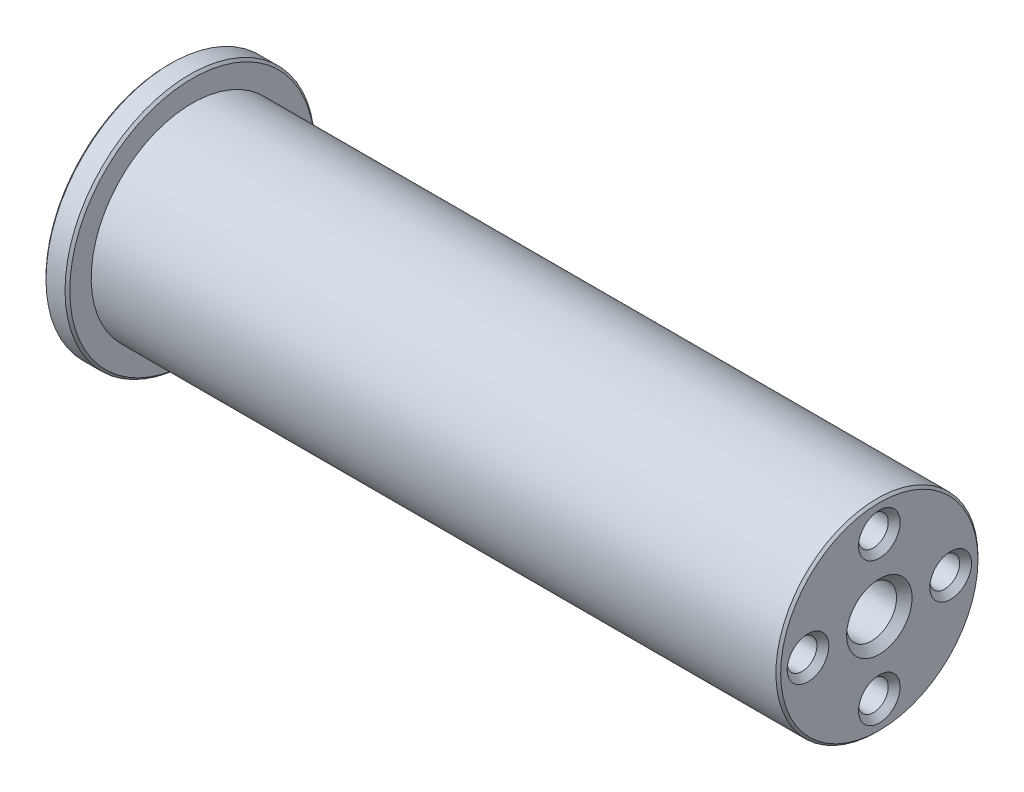
ISO-10303-21;
HEADER;
FILE_DESCRIPTION(('STEP AP214'),'2;1');
FILE_NAME('part.step','',(''),(''),'','','');
FILE_SCHEMA(('AUTOMOTIVE_DESIGN { 1 0 10303 214 1 1 1 1 }'));
ENDSEC;
DATA;
#1=APPLICATION_CONTEXT('core data for automotive mechanical design processes');
#2=APPLICATION_PROTOCOL_DEFINITION('international standard','automotive_design',2000,#1);
#3=PRODUCT_CONTEXT('',#1,'mechanical');
#4=PRODUCT('Part','Part','',(#3));
#5=PRODUCT_RELATED_PRODUCT_CATEGORY('part','',(#4));
#6=PRODUCT_DEFINITION_FORMATION('','',#4);
#7=PRODUCT_DEFINITION_CONTEXT('part definition',#1,'design');
#8=PRODUCT_DEFINITION('design','',#6,#7);
#9=PRODUCT_DEFINITION_SHAPE('','',#8);
#10=(LENGTH_UNIT() NAMED_UNIT(*) SI_UNIT(.MILLI.,.METRE.));
#11=(NAMED_UNIT(*) PLANE_ANGLE_UNIT() SI_UNIT($,.RADIAN.));
#12=(NAMED_UNIT(*) SI_UNIT($,.STERADIAN.) SOLID_ANGLE_UNIT());
#13=UNCERTAINTY_MEASURE_WITH_UNIT(LENGTH_MEASURE(1.E-05),#10,'distance_accuracy_value','');
#14=(GEOMETRIC_REPRESENTATION_CONTEXT(3) GLOBAL_UNCERTAINTY_ASSIGNED_CONTEXT((#13)) GLOBAL_UNIT_ASSIGNED_CONTEXT((#10,
#11,#12)) REPRESENTATION_CONTEXT('',''));
#15=CARTESIAN_POINT('',(0.,0.,0.));
#16=DIRECTION('',(0.,0.,1.));
#17=DIRECTION('',(1.,0.,0.));
#18=AXIS2_PLACEMENT_3D('',#15,#16,#17);
#19=CARTESIAN_POINT('',(64.8004303095138,-0.500000000036733,0.));
#20=DIRECTION('',(-1.,0.,0.));
#21=DIRECTION('',(0.,-1.,0.));
#22=AXIS2_PLACEMENT_3D('',#19,#20,#21);
#23=CYLINDRICAL_SURFACE('',#22,10.4999999999632);
#24=CARTESIAN_POINT('',(65.0004303095139,-0.500000000036733,0.));
#25=DIRECTION('',(-1.,0.,0.));
#26=DIRECTION('',(0.,0.,1.));
#27=AXIS2_PLACEMENT_3D('',#24,#25,#26);
#28=CIRCLE('',#27,10.4999999999632);
#29=CARTESIAN_POINT('',(65.0004303095139,-0.500000000036733,10.4999999999632));
#30=VERTEX_POINT('',#29);
#31=EDGE_CURVE('E58',#30,#30,#28,.F.);
#32=ORIENTED_EDGE('',*,*,#31,.T.);
#33=EDGE_LOOP('',(#32));
#34=FACE_BOUND('',#33,.T.);
#35=CARTESIAN_POINT('',(66.6004303095139,-0.500000000036733,0.));
#36=DIRECTION('',(1.,0.,0.));
#37=DIRECTION('',(0.,0.,-1.));
#38=AXIS2_PLACEMENT_3D('',#35,#36,#37);
#39=CIRCLE('',#38,10.4999999999632);
#40=CARTESIAN_POINT('',(66.6004303095139,-0.500000000036733,10.4999999999632));
#41=VERTEX_POINT('',#40);
#42=EDGE_CURVE('E154',#41,#41,#39,.F.);
#43=ORIENTED_EDGE('',*,*,#42,.T.);
#44=EDGE_LOOP('',(#43));
#45=FACE_BOUND('',#44,.T.);
#46=ADVANCED_FACE('F48',(#34,#45),#23,.T.);
#47=CARTESIAN_POINT('',(66.8004303095138,-11.,0.));
#48=DIRECTION('',(1.,0.,0.));
#49=DIRECTION('',(0.,1.,0.));
#50=AXIS2_PLACEMENT_3D('',#47,#48,#49);
#51=PLANE('',#50);
#52=CARTESIAN_POINT('',(66.8004303095138,-0.500000000036733,0.));
#53=DIRECTION('',(1.,0.,0.));
#54=DIRECTION('',(0.,1.,0.));
#55=AXIS2_PLACEMENT_3D('',#52,#53,#54);
#56=CIRCLE('',#55,10.2999999999633);
#57=CARTESIAN_POINT('',(66.8004303095138,-0.500000000036733,10.2999999999633));
#58=VERTEX_POINT('',#57);
#59=EDGE_CURVE('E11',#58,#58,#56,.T.);
#60=ORIENTED_EDGE('',*,*,#59,.T.);
#61=EDGE_LOOP('',(#60));
#62=FACE_BOUND('',#61,.T.);
#63=CARTESIAN_POINT('',(66.8004303095138,-0.500000000036733,0.));
#64=DIRECTION('',(-1.,0.,0.));
#65=DIRECTION('',(0.,-1.,0.));
#66=AXIS2_PLACEMENT_3D('',#63,#64,#65);
#67=CIRCLE('',#66,8.49999999996328);
#68=CARTESIAN_POINT('',(66.8004303095138,-9.00000000000001,0.));
#69=VERTEX_POINT('',#68);
#70=EDGE_CURVE('E127',#69,#69,#67,.T.);
#71=ORIENTED_EDGE('',*,*,#70,.T.);
#72=EDGE_LOOP('',(#71));
#73=FACE_BOUND('',#72,.T.);
#74=ADVANCED_FACE('F234',(#62,#73),#51,.T.);
#75=CARTESIAN_POINT('',(64.8004303095138,-0.500000000036733,0.));
#76=DIRECTION('',(-1.,0.,0.));
#77=DIRECTION('',(0.,-1.,0.));
#78=AXIS2_PLACEMENT_3D('',#75,#76,#77);
#79=CYLINDRICAL_SURFACE('',#78,8.49999999996328);
#80=CARTESIAN_POINT('',(124.400860619028,-0.500000000036723,0.));
#81=DIRECTION('',(1.,0.,0.));
#82=DIRECTION('',(0.,0.,-1.));
#83=AXIS2_PLACEMENT_3D('',#80,#81,#82);
#84=CIRCLE('',#83,8.49999999996328);
#85=CARTESIAN_POINT('',(124.400860619028,-0.500000000036723,-8.49999999996328));
#86=VERTEX_POINT('',#85);
#87=EDGE_CURVE('E131',#86,#86,#84,.F.);
#88=ORIENTED_EDGE('',*,*,#87,.T.);
#89=EDGE_LOOP('',(#88));
#90=FACE_BOUND('',#89,.T.);
#91=ORIENTED_EDGE('',*,*,#70,.F.);
#92=EDGE_LOOP('',(#91));
#93=FACE_BOUND('',#92,.T.);
#94=ADVANCED_FACE('F209',(#90,#93),#79,.T.);
#95=CARTESIAN_POINT('',(124.600860619028,-0.500000000036723,0.));
#96=DIRECTION('',(1.,0.,0.));
#97=DIRECTION('',(0.,1.,0.));
#98=AXIS2_PLACEMENT_3D('',#95,#96,#97);
#99=PLANE('',#98);
#100=CARTESIAN_POINT('',(124.600860619028,-0.500000000036723,0.));
#101=DIRECTION('',(1.,0.,0.));
#102=DIRECTION('',(0.,1.,0.));
#103=AXIS2_PLACEMENT_3D('',#100,#101,#102);
#104=CIRCLE('',#103,8.29999999996326);
#105=CARTESIAN_POINT('',(124.600860619028,7.79999999992654,0.));
#106=VERTEX_POINT('',#105);
#107=EDGE_CURVE('E146',#106,#106,#104,.T.);
#108=ORIENTED_EDGE('',*,*,#107,.T.);
#109=EDGE_LOOP('',(#108));
#110=FACE_BOUND('',#109,.T.);
#111=CARTESIAN_POINT('',(124.600860619028,-0.499999999999987,0.));
#112=DIRECTION('',(1.,0.,0.));
#113=DIRECTION('',(0.,0.,-1.));
#114=AXIS2_PLACEMENT_3D('',#111,#112,#113);
#115=CIRCLE('',#114,2.75);
#116=CARTESIAN_POINT('',(124.600860619028,-0.499999999999987,-2.75));
#117=VERTEX_POINT('',#116);
#118=EDGE_CURVE('E141',#117,#117,#115,.T.);
#119=ORIENTED_EDGE('',*,*,#118,.F.);
#120=EDGE_LOOP('',(#119));
#121=FACE_BOUND('',#120,.T.);
#122=CARTESIAN_POINT('',(124.600860619028,-0.500000000036785,-5.99999999996326));
#123=DIRECTION('',(1.,0.,0.));
#124=DIRECTION('',(0.,0.,-1.));
#125=AXIS2_PLACEMENT_3D('',#122,#123,#124);
#126=CIRCLE('',#125,1.75);
#127=CARTESIAN_POINT('',(124.600860619028,-0.500000000036785,-7.74999999996326));
#128=VERTEX_POINT('',#127);
#129=EDGE_CURVE('E92',#128,#128,#126,.T.);
#130=ORIENTED_EDGE('',*,*,#129,.F.);
#131=EDGE_LOOP('',(#130));
#132=FACE_BOUND('',#131,.T.);
#133=CARTESIAN_POINT('',(124.600860619028,5.49999999992654,0.));
#134=DIRECTION('',(1.,0.,0.));
#135=DIRECTION('',(0.,0.,-1.));
#136=AXIS2_PLACEMENT_3D('',#133,#134,#135);
#137=CIRCLE('',#136,1.75);
#138=CARTESIAN_POINT('',(124.600860619028,5.49999999992654,-1.75));
#139=VERTEX_POINT('',#138);
#140=EDGE_CURVE('E82',#139,#139,#137,.T.);
#141=ORIENTED_EDGE('',*,*,#140,.F.);
#142=EDGE_LOOP('',(#141));
#143=FACE_BOUND('',#142,.T.);
#144=CARTESIAN_POINT('',(124.600860619028,-0.500000000036702,5.99999999996326));
#145=DIRECTION('',(1.,0.,0.));
#146=DIRECTION('',(0.,0.,-1.));
#147=AXIS2_PLACEMENT_3D('',#144,#145,#146);
#148=CIRCLE('',#147,1.75);
#149=CARTESIAN_POINT('',(124.600860619028,-0.500000000036702,4.24999999996326));
#150=VERTEX_POINT('',#149);
#151=EDGE_CURVE('E103',#150,#150,#148,.T.);
#152=ORIENTED_EDGE('',*,*,#151,.F.);
#153=EDGE_LOOP('',(#152));
#154=FACE_BOUND('',#153,.T.);
#155=CARTESIAN_POINT('',(124.600860619028,-6.49999999999998,0.));
#156=DIRECTION('',(1.,0.,0.));
#157=DIRECTION('',(0.,0.,-1.));
#158=AXIS2_PLACEMENT_3D('',#155,#156,#157);
#159=CIRCLE('',#158,1.75);
#160=CARTESIAN_POINT('',(124.600860619028,-6.49999999999998,-1.75));
#161=VERTEX_POINT('',#160);
#162=EDGE_CURVE('E115',#161,#161,#159,.T.);
#163=ORIENTED_EDGE('',*,*,#162,.F.);
#164=EDGE_LOOP('',(#163));
#165=FACE_BOUND('',#164,.T.);
#166=ADVANCED_FACE('F174',(#110,#121,#132,#143,#154,#165),#99,.T.);
#167=CARTESIAN_POINT('',(64.8004303095138,-11.,0.));
#168=DIRECTION('',(-1.,0.,0.));
#169=DIRECTION('',(0.,-1.,0.));
#170=AXIS2_PLACEMENT_3D('',#167,#168,#169);
#171=PLANE('',#170);
#172=CARTESIAN_POINT('',(64.8004303095138,-0.500000000036733,0.));
#173=DIRECTION('',(-1.,0.,0.));
#174=DIRECTION('',(0.,-1.,0.));
#175=AXIS2_PLACEMENT_3D('',#172,#173,#174);
#176=CIRCLE('',#175,10.2999999999632);
#177=CARTESIAN_POINT('',(64.8004303095138,-10.7999999999999,0.));
#178=VERTEX_POINT('',#177);
#179=EDGE_CURVE('E150',#178,#178,#176,.T.);
#180=ORIENTED_EDGE('',*,*,#179,.T.);
#181=EDGE_LOOP('',(#180));
#182=FACE_BOUND('',#181,.T.);
#183=CARTESIAN_POINT('',(64.8004303095138,-0.499999999999996,0.));
#184=DIRECTION('',(-1.,0.,0.));
#185=DIRECTION('',(0.,0.,1.));
#186=AXIS2_PLACEMENT_3D('',#183,#184,#185);
#187=CIRCLE('',#186,2.75);
#188=CARTESIAN_POINT('',(64.8004303095138,-0.499999999999996,2.75));
#189=VERTEX_POINT('',#188);
#190=EDGE_CURVE('E178',#189,#189,#187,.T.);
#191=ORIENTED_EDGE('',*,*,#190,.F.);
#192=EDGE_LOOP('',(#191));
#193=FACE_BOUND('',#192,.T.);
#194=ADVANCED_FACE('F170',(#182,#193),#171,.T.);
#195=CARTESIAN_POINT('',(117.100860619028,-6.49999999999998,0.));
#196=DIRECTION('',(1.,0.,0.));
#197=DIRECTION('',(0.,0.,-1.));
#198=AXIS2_PLACEMENT_3D('',#195,#196,#197);
#199=CONICAL_SURFACE('',#198,1.25,1.02974425867666);
#200=CARTESIAN_POINT('',(116.349784845243,-6.49999999999998,0.));
#201=VERTEX_POINT('',#200);
#202=VERTEX_LOOP('',#201);
#203=FACE_BOUND('',#202,.T.);
#204=CARTESIAN_POINT('',(117.100860619028,-6.49999999999998,0.));
#205=DIRECTION('',(1.,0.,0.));
#206=DIRECTION('',(0.,0.,-1.));
#207=AXIS2_PLACEMENT_3D('',#204,#205,#206);
#208=CIRCLE('',#207,1.25);
#209=CARTESIAN_POINT('',(117.100860619028,-6.49999999999998,-1.25));
#210=VERTEX_POINT('',#209);
#211=EDGE_CURVE('E123',#210,#210,#208,.T.);
#212=ORIENTED_EDGE('',*,*,#211,.T.);
#213=EDGE_LOOP('',(#212));
#214=FACE_BOUND('',#213,.T.);
#215=ADVANCED_FACE('F173',(#203,#214),#199,.F.);
#216=CARTESIAN_POINT('',(124.600860619028,-6.49999999999998,0.));
#217=DIRECTION('',(1.,0.,0.));
#218=DIRECTION('',(0.,0.,-1.));
#219=AXIS2_PLACEMENT_3D('',#216,#217,#218);
#220=CYLINDRICAL_SURFACE('',#219,1.25);
#221=ORIENTED_EDGE('',*,*,#211,.F.);
#222=EDGE_LOOP('',(#221));
#223=FACE_BOUND('',#222,.T.);
#224=CARTESIAN_POINT('',(124.100860619028,-6.49999999999998,0.));
#225=DIRECTION('',(1.,0.,0.));
#226=DIRECTION('',(0.,0.,-1.));
#227=AXIS2_PLACEMENT_3D('',#224,#225,#226);
#228=CIRCLE('',#227,1.25);
#229=CARTESIAN_POINT('',(124.100860619028,-6.49999999999998,-1.25));
#230=VERTEX_POINT('',#229);
#231=EDGE_CURVE('E119',#230,#230,#228,.T.);
#232=ORIENTED_EDGE('',*,*,#231,.T.);
#233=EDGE_LOOP('',(#232));
#234=FACE_BOUND('',#233,.T.);
#235=ADVANCED_FACE('F221',(#223,#234),#220,.F.);
#236=CARTESIAN_POINT('',(124.600860619028,-6.49999999999998,0.));
#237=DIRECTION('',(1.,0.,0.));
#238=DIRECTION('',(0.,0.,-1.));
#239=AXIS2_PLACEMENT_3D('',#236,#237,#238);
#240=CONICAL_SURFACE('',#239,1.75,0.785398163397448);
#241=ORIENTED_EDGE('',*,*,#231,.F.);
#242=EDGE_LOOP('',(#241));
#243=FACE_BOUND('',#242,.T.);
#244=ORIENTED_EDGE('',*,*,#162,.T.);
#245=EDGE_LOOP('',(#244));
#246=FACE_BOUND('',#245,.T.);
#247=ADVANCED_FACE('F218',(#243,#246),#240,.F.);
#248=CARTESIAN_POINT('',(117.100860619028,-0.500000000036702,5.99999999996326));
#249=DIRECTION('',(1.,0.,0.));
#250=DIRECTION('',(0.,0.,-1.));
#251=AXIS2_PLACEMENT_3D('',#248,#249,#250);
#252=CONICAL_SURFACE('',#251,1.25,1.02974425867666);
#253=CARTESIAN_POINT('',(116.349784845243,-0.500000000036704,5.99999999996326));
#254=VERTEX_POINT('',#253);
#255=VERTEX_LOOP('',#254);
#256=FACE_BOUND('',#255,.T.);
#257=CARTESIAN_POINT('',(117.100860619028,-0.500000000036702,5.99999999996326));
#258=DIRECTION('',(1.,0.,0.));
#259=DIRECTION('',(0.,0.,-1.));
#260=AXIS2_PLACEMENT_3D('',#257,#258,#259);
#261=CIRCLE('',#260,1.25);
#262=CARTESIAN_POINT('',(117.100860619028,-0.500000000036702,4.74999999996326));
#263=VERTEX_POINT('',#262);
#264=EDGE_CURVE('E111',#263,#263,#261,.T.);
#265=ORIENTED_EDGE('',*,*,#264,.T.);
#266=EDGE_LOOP('',(#265));
#267=FACE_BOUND('',#266,.T.);
#268=ADVANCED_FACE('F220',(#256,#267),#252,.F.);
#269=CARTESIAN_POINT('',(124.600860619028,-0.500000000036702,5.99999999996326));
#270=DIRECTION('',(1.,0.,0.));
#271=DIRECTION('',(0.,0.,-1.));
#272=AXIS2_PLACEMENT_3D('',#269,#270,#271);
#273=CYLINDRICAL_SURFACE('',#272,1.25);
#274=ORIENTED_EDGE('',*,*,#264,.F.);
#275=EDGE_LOOP('',(#274));
#276=FACE_BOUND('',#275,.T.);
#277=CARTESIAN_POINT('',(124.100860619028,-0.500000000036702,5.99999999996326));
#278=DIRECTION('',(1.,0.,0.));
#279=DIRECTION('',(0.,0.,-1.));
#280=AXIS2_PLACEMENT_3D('',#277,#278,#279);
#281=CIRCLE('',#280,1.25);
#282=CARTESIAN_POINT('',(124.100860619028,-0.500000000036702,4.74999999996326));
#283=VERTEX_POINT('',#282);
#284=EDGE_CURVE('E107',#283,#283,#281,.T.);
#285=ORIENTED_EDGE('',*,*,#284,.T.);
#286=EDGE_LOOP('',(#285));
#287=FACE_BOUND('',#286,.T.);
#288=ADVANCED_FACE('F228',(#276,#287),#273,.F.);
#289=CARTESIAN_POINT('',(124.600860619028,-0.500000000036702,5.99999999996326));
#290=DIRECTION('',(1.,0.,0.));
#291=DIRECTION('',(0.,0.,-1.));
#292=AXIS2_PLACEMENT_3D('',#289,#290,#291);
#293=CONICAL_SURFACE('',#292,1.75,0.785398163397449);
#294=ORIENTED_EDGE('',*,*,#284,.F.);
#295=EDGE_LOOP('',(#294));
#296=FACE_BOUND('',#295,.T.);
#297=ORIENTED_EDGE('',*,*,#151,.T.);
#298=EDGE_LOOP('',(#297));
#299=FACE_BOUND('',#298,.T.);
#300=ADVANCED_FACE('F292',(#296,#299),#293,.F.);
#301=CARTESIAN_POINT('',(117.100860619028,5.49999999992654,0.));
#302=DIRECTION('',(1.,0.,0.));
#303=DIRECTION('',(0.,0.,-1.));
#304=AXIS2_PLACEMENT_3D('',#301,#302,#303);
#305=CONICAL_SURFACE('',#304,1.25,1.02974425867666);
#306=CARTESIAN_POINT('',(116.349784845243,5.49999999992653,0.));
#307=VERTEX_POINT('',#306);
#308=VERTEX_LOOP('',#307);
#309=FACE_BOUND('',#308,.T.);
#310=CARTESIAN_POINT('',(117.100860619028,5.49999999992654,0.));
#311=DIRECTION('',(1.,0.,0.));
#312=DIRECTION('',(0.,0.,-1.));
#313=AXIS2_PLACEMENT_3D('',#310,#311,#312);
#314=CIRCLE('',#313,1.25);
#315=CARTESIAN_POINT('',(117.100860619028,5.49999999992654,-1.25));
#316=VERTEX_POINT('',#315);
#317=EDGE_CURVE('E99',#316,#316,#314,.T.);
#318=ORIENTED_EDGE('',*,*,#317,.T.);
#319=EDGE_LOOP('',(#318));
#320=FACE_BOUND('',#319,.T.);
#321=ADVANCED_FACE('F305',(#309,#320),#305,.F.);
#322=CARTESIAN_POINT('',(124.600860619028,5.49999999992654,0.));
#323=DIRECTION('',(1.,0.,0.));
#324=DIRECTION('',(0.,0.,-1.));
#325=AXIS2_PLACEMENT_3D('',#322,#323,#324);
#326=CYLINDRICAL_SURFACE('',#325,1.25);
#327=ORIENTED_EDGE('',*,*,#317,.F.);
#328=EDGE_LOOP('',(#327));
#329=FACE_BOUND('',#328,.T.);
#330=CARTESIAN_POINT('',(124.100860619028,5.49999999992654,0.));
#331=DIRECTION('',(1.,0.,0.));
#332=DIRECTION('',(0.,0.,-1.));
#333=AXIS2_PLACEMENT_3D('',#330,#331,#332);
#334=CIRCLE('',#333,1.25);
#335=CARTESIAN_POINT('',(124.100860619028,5.49999999992654,-1.25));
#336=VERTEX_POINT('',#335);
#337=EDGE_CURVE('E89',#336,#336,#334,.T.);
#338=ORIENTED_EDGE('',*,*,#337,.T.);
#339=EDGE_LOOP('',(#338));
#340=FACE_BOUND('',#339,.T.);
#341=ADVANCED_FACE('F301',(#329,#340),#326,.F.);
#342=CARTESIAN_POINT('',(124.600860619028,5.49999999992654,0.));
#343=DIRECTION('',(1.,0.,0.));
#344=DIRECTION('',(0.,0.,-1.));
#345=AXIS2_PLACEMENT_3D('',#342,#343,#344);
#346=CONICAL_SURFACE('',#345,1.75,0.785398163397448);
#347=ORIENTED_EDGE('',*,*,#337,.F.);
#348=EDGE_LOOP('',(#347));
#349=FACE_BOUND('',#348,.T.);
#350=ORIENTED_EDGE('',*,*,#140,.T.);
#351=EDGE_LOOP('',(#350));
#352=FACE_BOUND('',#351,.T.);
#353=ADVANCED_FACE('F75',(#349,#352),#346,.F.);
#354=CARTESIAN_POINT('',(117.100860619028,-0.500000000036785,-5.99999999996326));
#355=DIRECTION('',(1.,0.,0.));
#356=DIRECTION('',(0.,0.,-1.));
#357=AXIS2_PLACEMENT_3D('',#354,#355,#356);
#358=CONICAL_SURFACE('',#357,1.25,1.02974425867666);
#359=CARTESIAN_POINT('',(116.349784845243,-0.500000000036787,-5.99999999996326));
#360=VERTEX_POINT('',#359);
#361=VERTEX_LOOP('',#360);
#362=FACE_BOUND('',#361,.T.);
#363=CARTESIAN_POINT('',(117.100860619028,-0.500000000036785,-5.99999999996326));
#364=DIRECTION('',(1.,0.,0.));
#365=DIRECTION('',(0.,0.,-1.));
#366=AXIS2_PLACEMENT_3D('',#363,#364,#365);
#367=CIRCLE('',#366,1.25);
#368=CARTESIAN_POINT('',(117.100860619028,-0.500000000036785,-7.24999999996325));
#369=VERTEX_POINT('',#368);
#370=EDGE_CURVE('E79',#369,#369,#367,.T.);
#371=ORIENTED_EDGE('',*,*,#370,.T.);
#372=EDGE_LOOP('',(#371));
#373=FACE_BOUND('',#372,.T.);
#374=ADVANCED_FACE('F71',(#362,#373),#358,.F.);
#375=CARTESIAN_POINT('',(124.600860619028,-0.500000000036785,-5.99999999996326));
#376=DIRECTION('',(1.,0.,0.));
#377=DIRECTION('',(0.,0.,-1.));
#378=AXIS2_PLACEMENT_3D('',#375,#376,#377);
#379=CYLINDRICAL_SURFACE('',#378,1.25);
#380=ORIENTED_EDGE('',*,*,#370,.F.);
#381=EDGE_LOOP('',(#380));
#382=FACE_BOUND('',#381,.T.);
#383=CARTESIAN_POINT('',(124.100860619028,-0.500000000036785,-5.99999999996326));
#384=DIRECTION('',(1.,0.,0.));
#385=DIRECTION('',(0.,0.,-1.));
#386=AXIS2_PLACEMENT_3D('',#383,#384,#385);
#387=CIRCLE('',#386,1.25);
#388=CARTESIAN_POINT('',(124.100860619028,-0.500000000036785,-7.24999999996326));
#389=VERTEX_POINT('',#388);
#390=EDGE_CURVE('E83',#389,#389,#387,.T.);
#391=ORIENTED_EDGE('',*,*,#390,.T.);
#392=EDGE_LOOP('',(#391));
#393=FACE_BOUND('',#392,.T.);
#394=ADVANCED_FACE('F74',(#382,#393),#379,.F.);
#395=CARTESIAN_POINT('',(124.600860619028,-0.500000000036785,-5.99999999996326));
#396=DIRECTION('',(1.,0.,0.));
#397=DIRECTION('',(0.,0.,-1.));
#398=AXIS2_PLACEMENT_3D('',#395,#396,#397);
#399=CONICAL_SURFACE('',#398,1.75,0.785398163397449);
#400=ORIENTED_EDGE('',*,*,#390,.F.);
#401=EDGE_LOOP('',(#400));
#402=FACE_BOUND('',#401,.T.);
#403=ORIENTED_EDGE('',*,*,#129,.T.);
#404=EDGE_LOOP('',(#403));
#405=FACE_BOUND('',#404,.T.);
#406=ADVANCED_FACE('F205',(#402,#405),#399,.F.);
#407=CARTESIAN_POINT('',(124.600860619028,-0.499999999999992,0.));
#408=DIRECTION('',(1.,0.,0.));
#409=DIRECTION('',(0.,0.,-1.));
#410=AXIS2_PLACEMENT_3D('',#407,#408,#409);
#411=CYLINDRICAL_SURFACE('',#410,1.49999999999999);
#412=CARTESIAN_POINT('',(102.,-0.499999999999996,0.));
#413=DIRECTION('',(-1.,0.,0.));
#414=DIRECTION('',(0.,0.,1.));
#415=AXIS2_PLACEMENT_3D('',#412,#413,#414);
#416=CIRCLE('',#415,1.49999999999999);
#417=CARTESIAN_POINT('',(102.,-0.499999999999996,1.49999999999999));
#418=VERTEX_POINT('',#417);
#419=EDGE_CURVE('E137',#418,#418,#416,.T.);
#420=ORIENTED_EDGE('',*,*,#419,.T.);
#421=EDGE_LOOP('',(#420));
#422=FACE_BOUND('',#421,.T.);
#423=CARTESIAN_POINT('',(114.,-0.499999999999987,0.));
#424=DIRECTION('',(1.,0.,0.));
#425=DIRECTION('',(0.,0.,-1.));
#426=AXIS2_PLACEMENT_3D('',#423,#424,#425);
#427=CIRCLE('',#426,1.49999999999999);
#428=CARTESIAN_POINT('',(114.,-0.499999999999987,-1.49999999999999));
#429=VERTEX_POINT('',#428);
#430=EDGE_CURVE('E132',#429,#429,#427,.T.);
#431=ORIENTED_EDGE('',*,*,#430,.T.);
#432=EDGE_LOOP('',(#431));
#433=FACE_BOUND('',#432,.T.);
#434=ADVANCED_FACE('F418',(#422,#433),#411,.F.);
#435=CARTESIAN_POINT('',(114.360516371417,-0.499999999999987,0.));
#436=DIRECTION('',(1.,0.,0.));
#437=DIRECTION('',(0.,0.,-1.));
#438=AXIS2_PLACEMENT_3D('',#435,#436,#437);
#439=CONICAL_SURFACE('',#438,2.1,1.02974425867665);
#440=CARTESIAN_POINT('',(114.360516371417,-0.499999999999987,0.));
#441=DIRECTION('',(1.,0.,0.));
#442=DIRECTION('',(0.,0.,-1.));
#443=AXIS2_PLACEMENT_3D('',#440,#441,#442);
#444=CIRCLE('',#443,2.1);
#445=CARTESIAN_POINT('',(114.360516371417,-0.499999999999987,-2.1));
#446=VERTEX_POINT('',#445);
#447=EDGE_CURVE('E136',#446,#446,#444,.T.);
#448=ORIENTED_EDGE('',*,*,#447,.T.);
#449=EDGE_LOOP('',(#448));
#450=FACE_BOUND('',#449,.T.);
#451=ORIENTED_EDGE('',*,*,#430,.F.);
#452=EDGE_LOOP('',(#451));
#453=FACE_BOUND('',#452,.T.);
#454=ADVANCED_FACE('F327',(#450,#453),#439,.F.);
#455=CARTESIAN_POINT('',(124.600860619028,-0.499999999999987,0.));
#456=DIRECTION('',(1.,0.,0.));
#457=DIRECTION('',(0.,0.,-1.));
#458=AXIS2_PLACEMENT_3D('',#455,#456,#457);
#459=CYLINDRICAL_SURFACE('',#458,2.1);
#460=ORIENTED_EDGE('',*,*,#447,.F.);
#461=EDGE_LOOP('',(#460));
#462=FACE_BOUND('',#461,.T.);
#463=CARTESIAN_POINT('',(123.950860619028,-0.499999999999987,0.));
#464=DIRECTION('',(1.,0.,0.));
#465=DIRECTION('',(0.,0.,-1.));
#466=AXIS2_PLACEMENT_3D('',#463,#464,#465);
#467=CIRCLE('',#466,2.1);
#468=CARTESIAN_POINT('',(123.950860619028,-0.499999999999987,-2.1));
#469=VERTEX_POINT('',#468);
#470=EDGE_CURVE('E194',#469,#469,#467,.T.);
#471=ORIENTED_EDGE('',*,*,#470,.T.);
#472=EDGE_LOOP('',(#471));
#473=FACE_BOUND('',#472,.T.);
#474=ADVANCED_FACE('F322',(#462,#473),#459,.F.);
#475=CARTESIAN_POINT('',(124.600860619028,-0.499999999999987,0.));
#476=DIRECTION('',(1.,0.,0.));
#477=DIRECTION('',(0.,0.,-1.));
#478=AXIS2_PLACEMENT_3D('',#475,#476,#477);
#479=CONICAL_SURFACE('',#478,2.75,0.78539816339745);
#480=ORIENTED_EDGE('',*,*,#470,.F.);
#481=EDGE_LOOP('',(#480));
#482=FACE_BOUND('',#481,.T.);
#483=ORIENTED_EDGE('',*,*,#118,.T.);
#484=EDGE_LOOP('',(#483));
#485=FACE_BOUND('',#484,.T.);
#486=ADVANCED_FACE('F326',(#482,#485),#479,.F.);
#487=CARTESIAN_POINT('',(101.399139380972,-0.499999999999996,0.));
#488=DIRECTION('',(-1.,0.,0.));
#489=DIRECTION('',(0.,0.,1.));
#490=AXIS2_PLACEMENT_3D('',#487,#488,#489);
#491=CONICAL_SURFACE('',#490,2.49999999999999,1.02974425867665);
#492=CARTESIAN_POINT('',(101.399139380972,-0.499999999999996,0.));
#493=DIRECTION('',(-1.,0.,0.));
#494=DIRECTION('',(0.,0.,1.));
#495=AXIS2_PLACEMENT_3D('',#492,#493,#494);
#496=CIRCLE('',#495,2.49999999999999);
#497=CARTESIAN_POINT('',(101.399139380972,-0.499999999999996,2.49999999999999));
#498=VERTEX_POINT('',#497);
#499=EDGE_CURVE('E142',#498,#498,#496,.T.);
#500=ORIENTED_EDGE('',*,*,#499,.T.);
#501=EDGE_LOOP('',(#500));
#502=FACE_BOUND('',#501,.T.);
#503=ORIENTED_EDGE('',*,*,#419,.F.);
#504=EDGE_LOOP('',(#503));
#505=FACE_BOUND('',#504,.T.);
#506=ADVANCED_FACE('F340',(#502,#505),#491,.F.);
#507=CARTESIAN_POINT('',(64.8004303095138,-0.499999999999996,0.));
#508=DIRECTION('',(-1.,0.,0.));
#509=DIRECTION('',(0.,0.,1.));
#510=AXIS2_PLACEMENT_3D('',#507,#508,#509);
#511=CYLINDRICAL_SURFACE('',#510,2.49999999999999);
#512=ORIENTED_EDGE('',*,*,#499,.F.);
#513=EDGE_LOOP('',(#512));
#514=FACE_BOUND('',#513,.T.);
#515=CARTESIAN_POINT('',(65.0504303095138,-0.499999999999996,0.));
#516=DIRECTION('',(-1.,0.,0.));
#517=DIRECTION('',(0.,0.,1.));
#518=AXIS2_PLACEMENT_3D('',#515,#516,#517);
#519=CIRCLE('',#518,2.5);
#520=CARTESIAN_POINT('',(65.0504303095138,-0.499999999999996,2.5));
#521=VERTEX_POINT('',#520);
#522=EDGE_CURVE('E181',#521,#521,#519,.T.);
#523=ORIENTED_EDGE('',*,*,#522,.T.);
#524=EDGE_LOOP('',(#523));
#525=FACE_BOUND('',#524,.T.);
#526=ADVANCED_FACE('F257',(#514,#525),#511,.F.);
#527=CARTESIAN_POINT('',(64.8004303095138,-0.499999999999996,0.));
#528=DIRECTION('',(-1.,0.,0.));
#529=DIRECTION('',(0.,0.,1.));
#530=AXIS2_PLACEMENT_3D('',#527,#528,#529);
#531=CONICAL_SURFACE('',#530,2.75,0.785398163397457);
#532=ORIENTED_EDGE('',*,*,#522,.F.);
#533=EDGE_LOOP('',(#532));
#534=FACE_BOUND('',#533,.T.);
#535=ORIENTED_EDGE('',*,*,#190,.T.);
#536=EDGE_LOOP('',(#535));
#537=FACE_BOUND('',#536,.T.);
#538=ADVANCED_FACE('F248',(#534,#537),#531,.F.);
#539=CARTESIAN_POINT('',(124.400860619028,-0.500000000036723,0.));
#540=DIRECTION('',(-1.,0.,0.));
#541=DIRECTION('',(0.,0.,1.));
#542=AXIS2_PLACEMENT_3D('',#539,#540,#541);
#543=CONICAL_SURFACE('',#542,8.49999999996328,0.785398163397392);
#544=ORIENTED_EDGE('',*,*,#107,.F.);
#545=EDGE_LOOP('',(#544));
#546=FACE_BOUND('',#545,.T.);
#547=ORIENTED_EDGE('',*,*,#87,.F.);
#548=EDGE_LOOP('',(#547));
#549=FACE_BOUND('',#548,.T.);
#550=ADVANCED_FACE('F167',(#546,#549),#543,.T.);
#551=CARTESIAN_POINT('',(64.8004303095138,-0.500000000036733,0.));
#552=DIRECTION('',(1.,0.,0.));
#553=DIRECTION('',(0.,0.,-1.));
#554=AXIS2_PLACEMENT_3D('',#551,#552,#553);
#555=CONICAL_SURFACE('',#554,10.2999999999632,0.785398163397427);
#556=ORIENTED_EDGE('',*,*,#31,.F.);
#557=EDGE_LOOP('',(#556));
#558=FACE_BOUND('',#557,.T.);
#559=ORIENTED_EDGE('',*,*,#179,.F.);
#560=EDGE_LOOP('',(#559));
#561=FACE_BOUND('',#560,.T.);
#562=ADVANCED_FACE('F164',(#558,#561),#555,.T.);
#563=CARTESIAN_POINT('',(66.6004303095139,-0.500000000036733,0.));
#564=DIRECTION('',(-1.,0.,0.));
#565=DIRECTION('',(0.,0.,1.));
#566=AXIS2_PLACEMENT_3D('',#563,#564,#565);
#567=CONICAL_SURFACE('',#566,10.4999999999632,0.785398163397435);
#568=CARTESIAN_POINT('',(66.8004303095138,-0.500000000036733,10.2999999999633));
#569=CARTESIAN_POINT('',(66.7983469761805,-0.500000000036733,10.3020833332966));
#570=CARTESIAN_POINT('',(66.7962636428472,-0.500000000036733,10.3041666666299));
#571=CARTESIAN_POINT('',(66.7920969761805,-0.500000000036733,10.3083333332966));
#572=CARTESIAN_POINT('',(66.7900136428471,-0.500000000036733,10.3104166666299));
#573=CARTESIAN_POINT('',(66.7858469761805,-0.500000000036733,10.3145833332966));
#574=CARTESIAN_POINT('',(66.7837636428471,-0.500000000036733,10.3166666666299));
#575=CARTESIAN_POINT('',(66.7795969761805,-0.500000000036733,10.3208333332966));
#576=CARTESIAN_POINT('',(66.7775136428472,-0.500000000036733,10.3229166666299));
#577=CARTESIAN_POINT('',(66.7733469761805,-0.500000000036733,10.3270833332966));
#578=CARTESIAN_POINT('',(66.7712636428471,-0.500000000036733,10.3291666666299));
#579=CARTESIAN_POINT('',(66.7670969761805,-0.500000000036733,10.3333333332966));
#580=CARTESIAN_POINT('',(66.7650136428472,-0.500000000036733,10.3354166666299));
#581=CARTESIAN_POINT('',(66.7608469761805,-0.500000000036733,10.3395833332966));
#582=CARTESIAN_POINT('',(66.7587636428471,-0.500000000036733,10.3416666666299));
#583=CARTESIAN_POINT('',(66.7545969761805,-0.500000000036733,10.3458333332966));
#584=CARTESIAN_POINT('',(66.7525136428471,-0.500000000036733,10.3479166666299));
#585=CARTESIAN_POINT('',(66.7483469761805,-0.500000000036733,10.3520833332966));
#586=CARTESIAN_POINT('',(66.7462636428472,-0.500000000036733,10.3541666666299));
#587=CARTESIAN_POINT('',(66.7420969761805,-0.500000000036733,10.3583333332966));
#588=CARTESIAN_POINT('',(66.7400136428471,-0.500000000036733,10.3604166666299));
#589=CARTESIAN_POINT('',(66.7358469761805,-0.500000000036733,10.3645833332966));
#590=CARTESIAN_POINT('',(66.7337636428472,-0.500000000036733,10.3666666666299));
#591=CARTESIAN_POINT('',(66.7295969761805,-0.500000000036733,10.3708333332966));
#592=CARTESIAN_POINT('',(66.7275136428472,-0.500000000036733,10.3729166666299));
#593=CARTESIAN_POINT('',(66.7233469761805,-0.500000000036733,10.3770833332966));
#594=CARTESIAN_POINT('',(66.7212636428471,-0.500000000036733,10.3791666666299));
#595=CARTESIAN_POINT('',(66.7170969761805,-0.500000000036733,10.3833333332966));
#596=CARTESIAN_POINT('',(66.7150136428472,-0.500000000036733,10.3854166666299));
#597=CARTESIAN_POINT('',(66.7108469761805,-0.500000000036733,10.3895833332966));
#598=CARTESIAN_POINT('',(66.7087636428472,-0.500000000036733,10.3916666666299));
#599=CARTESIAN_POINT('',(66.7045969761805,-0.500000000036733,10.3958333332966));
#600=CARTESIAN_POINT('',(66.7025136428472,-0.500000000036733,10.3979166666299));
#601=CARTESIAN_POINT('',(66.6983469761805,-0.500000000036733,10.4020833332966));
#602=CARTESIAN_POINT('',(66.6962636428472,-0.500000000036733,10.4041666666299));
#603=CARTESIAN_POINT('',(66.6920969761805,-0.500000000036733,10.4083333332966));
#604=CARTESIAN_POINT('',(66.6900136428472,-0.500000000036733,10.4104166666299));
#605=CARTESIAN_POINT('',(66.6858469761805,-0.500000000036733,10.4145833332966));
#606=CARTESIAN_POINT('',(66.6837636428472,-0.500000000036733,10.4166666666299));
#607=CARTESIAN_POINT('',(66.6795969761805,-0.500000000036733,10.4208333332966));
#608=CARTESIAN_POINT('',(66.6775136428472,-0.500000000036733,10.4229166666299));
#609=CARTESIAN_POINT('',(66.6733469761805,-0.500000000036733,10.4270833332966));
#610=CARTESIAN_POINT('',(66.6712636428472,-0.500000000036733,10.4291666666299));
#611=CARTESIAN_POINT('',(66.6670969761805,-0.500000000036733,10.4333333332966));
#612=CARTESIAN_POINT('',(66.6650136428472,-0.500000000036733,10.4354166666299));
#613=CARTESIAN_POINT('',(66.6608469761805,-0.500000000036733,10.4395833332966));
#614=CARTESIAN_POINT('',(66.6587636428472,-0.500000000036733,10.4416666666299));
#615=CARTESIAN_POINT('',(66.6545969761805,-0.500000000036733,10.4458333332966));
#616=CARTESIAN_POINT('',(66.6525136428472,-0.500000000036733,10.4479166666299));
#617=CARTESIAN_POINT('',(66.6483469761805,-0.500000000036733,10.4520833332966));
#618=CARTESIAN_POINT('',(66.6462636428472,-0.500000000036733,10.4541666666299));
#619=CARTESIAN_POINT('',(66.6420969761805,-0.500000000036733,10.4583333332966));
#620=CARTESIAN_POINT('',(66.6400136428472,-0.500000000036733,10.4604166666299));
#621=CARTESIAN_POINT('',(66.6358469761805,-0.500000000036733,10.4645833332966));
#622=CARTESIAN_POINT('',(66.6337636428472,-0.500000000036733,10.4666666666299));
#623=CARTESIAN_POINT('',(66.6295969761805,-0.500000000036733,10.4708333332966));
#624=CARTESIAN_POINT('',(66.6275136428472,-0.500000000036733,10.4729166666299));
#625=CARTESIAN_POINT('',(66.6233469761805,-0.500000000036733,10.4770833332966));
#626=CARTESIAN_POINT('',(66.6212636428472,-0.500000000036733,10.4791666666299));
#627=CARTESIAN_POINT('',(66.6170969761805,-0.500000000036733,10.4833333332966));
#628=CARTESIAN_POINT('',(66.6150136428472,-0.500000000036733,10.4854166666299));
#629=CARTESIAN_POINT('',(66.6108469761805,-0.500000000036733,10.4895833332966));
#630=CARTESIAN_POINT('',(66.6087636428472,-0.500000000036733,10.4916666666299));
#631=CARTESIAN_POINT('',(66.6045969761805,-0.500000000036733,10.4958333332966));
#632=CARTESIAN_POINT('',(66.6025136428472,-0.500000000036733,10.4979166666299));
#633=CARTESIAN_POINT('',(66.6004303095139,-0.500000000036733,10.4999999999632));
#634=B_SPLINE_CURVE_WITH_KNOTS('',3,(#568,#569,#570,#571,#572,#573,#574,#575,#576,#577,#578,
#579,#580,#581,#582,#583,#584,#585,#586,#587,#588,#589,#590,#591,#592,#593,#594,#595,#596,#597,
#598,#599,#600,#601,#602,#603,#604,#605,#606,#607,#608,#609,#610,#611,#612,#613,#614,#615,#616,
#617,#618,#619,#620,#621,#622,#623,#624,#625,#626,#627,#628,#629,#630,#631,#632,#633),
.UNSPECIFIED.,.F.,.F.,(4,2,2,2,2,2,2,2,2,2,2,2,2,2,2,2,2,2,2,2,2,2,2,2,2,2,2,2,2,2,2,2,4),(0.,
0.00883883476483087,0.0176776695296617,0.0265165042944926,0.0353553390593235,0.0441941738241543,
0.053033008588984,0.0618718433538149,0.0707106781186457,0.0795495128834766,0.0883883476483075,
0.0972271824131383,0.106066017177969,0.1149048519428,0.123743686707631,0.132582521472462,
0.141421356237293,0.150260191002122,0.159099025766953,0.167937860531784,0.176776695296615,
0.185615530061446,0.194454364826277,0.203293199591108,0.212132034355938,0.220970869120769,
0.2298097038856,0.23864853865043,0.247487373415261,0.256326208180092,0.265165042944922,
0.274003877709753,0.282842712474574),.UNSPECIFIED.);
#635=EDGE_CURVE('BSEAM51',#58,#41,#634,.T.);
#636=ORIENTED_EDGE('',*,*,#59,.F.);
#637=ORIENTED_EDGE('',*,*,#42,.F.);
#638=ORIENTED_EDGE('',*,*,#635,.T.);
#639=ORIENTED_EDGE('',*,*,#635,.F.);
#640=EDGE_LOOP('',(#636,#638,#637,#639));
#641=FACE_BOUND('',#640,.T.);
#642=ADVANCED_FACE('F51',(#641),#567,.T.);
#643=CLOSED_SHELL('',(#46,#74,#94,#166,#194,#215,#235,#247,#268,#288,#300,#321,#341,#353,#374,
#394,#406,#434,#454,#474,#486,#506,#526,#538,#550,#562,#642));
#644=MANIFOLD_SOLID_BREP('B2',#643);
#645=ADVANCED_BREP_SHAPE_REPRESENTATION('',(#18,#644),#14);
#646=SHAPE_DEFINITION_REPRESENTATION(#9,#645);
ENDSEC;
END-ISO-10303-21;
